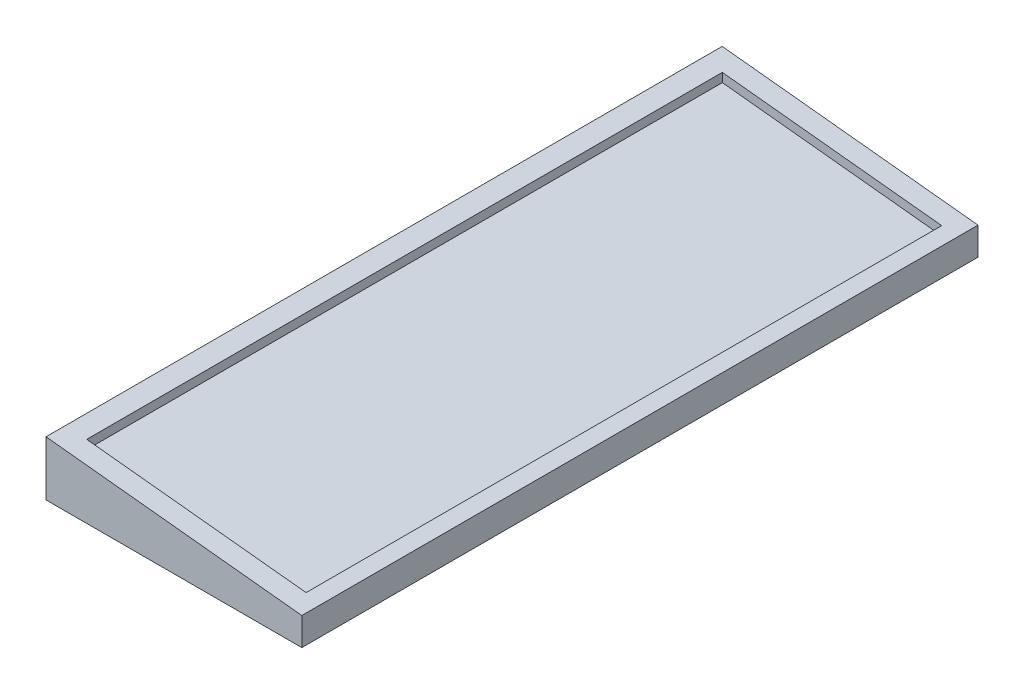
ISO-10303-21;
HEADER;
FILE_DESCRIPTION(('STEP AP214'),'2;1');
FILE_NAME('part.step','',(''),(''),'','','');
FILE_SCHEMA(('AUTOMOTIVE_DESIGN { 1 0 10303 214 1 1 1 1 }'));
ENDSEC;
DATA;
#1=APPLICATION_CONTEXT('core data for automotive mechanical design processes');
#2=APPLICATION_PROTOCOL_DEFINITION('international standard','automotive_design',2000,#1);
#3=PRODUCT_CONTEXT('',#1,'mechanical');
#4=PRODUCT('Part','Part','',(#3));
#5=PRODUCT_RELATED_PRODUCT_CATEGORY('part','',(#4));
#6=PRODUCT_DEFINITION_FORMATION('','',#4);
#7=PRODUCT_DEFINITION_CONTEXT('part definition',#1,'design');
#8=PRODUCT_DEFINITION('design','',#6,#7);
#9=PRODUCT_DEFINITION_SHAPE('','',#8);
#10=(LENGTH_UNIT() NAMED_UNIT(*) SI_UNIT(.MILLI.,.METRE.));
#11=(NAMED_UNIT(*) PLANE_ANGLE_UNIT() SI_UNIT($,.RADIAN.));
#12=(NAMED_UNIT(*) SI_UNIT($,.STERADIAN.) SOLID_ANGLE_UNIT());
#13=UNCERTAINTY_MEASURE_WITH_UNIT(LENGTH_MEASURE(1.E-05),#10,'distance_accuracy_value','');
#14=(GEOMETRIC_REPRESENTATION_CONTEXT(3) GLOBAL_UNCERTAINTY_ASSIGNED_CONTEXT((#13)) GLOBAL_UNIT_ASSIGNED_CONTEXT((#10,
#11,#12)) REPRESENTATION_CONTEXT('',''));
#15=CARTESIAN_POINT('',(0.,0.,0.));
#16=DIRECTION('',(0.,0.,1.));
#17=DIRECTION('',(1.,0.,0.));
#18=AXIS2_PLACEMENT_3D('',#15,#16,#17);
#19=CARTESIAN_POINT('',(1.80331095467036,15.6573576470199,0.));
#20=DIRECTION('',(0.104528463267646,0.994521895368274,0.));
#21=DIRECTION('',(-0.994521895368274,0.104528463267646,0.));
#22=AXIS2_PLACEMENT_3D('',#19,#20,#21);
#23=PLANE('',#22);
#24=DIRECTION('',(1.51465987561138E-13,0.,1.));
#25=VECTOR('',#24,1.);
#26=CARTESIAN_POINT('',(-61.4999999999144,22.3108037346864,9.6942194870283E-12));
#27=LINE('',#26,#25);
#28=CARTESIAN_POINT('',(-61.4999999999707,22.3108037346923,-372.27000000002));
#29=VERTEX_POINT('',#28);
#30=CARTESIAN_POINT('',(-61.499999999916,22.3108037346866,-11.0000000000191));
#31=VERTEX_POINT('',#30);
#32=EDGE_CURVE('E13',#29,#31,#27,.T.);
#33=ORIENTED_EDGE('',*,*,#32,.F.);
#34=DIRECTION('',(-0.994521895368274,0.104528463267646,0.));
#35=VECTOR('',#34,1.);
#36=CARTESIAN_POINT('',(1.80331095467036,15.6573576470199,-372.27000000002));
#37=LINE('',#36,#35);
#38=CARTESIAN_POINT('',(61.4999999999718,9.38298279702108,-372.27000000002));
#39=VERTEX_POINT('',#38);
#40=EDGE_CURVE('E145',#39,#29,#37,.T.);
#41=ORIENTED_EDGE('',*,*,#40,.F.);
#42=DIRECTION('',(0.,0.,-1.));
#43=VECTOR('',#42,1.);
#44=CARTESIAN_POINT('',(61.4999999999718,9.38298279702108,0.));
#45=LINE('',#44,#43);
#46=CARTESIAN_POINT('',(61.4999999999718,9.38298279702108,-11.0000000000191));
#47=VERTEX_POINT('',#46);
#48=EDGE_CURVE('E147',#47,#39,#45,.T.);
#49=ORIENTED_EDGE('',*,*,#48,.F.);
#50=DIRECTION('',(0.994521895368274,-0.104528463267646,0.));
#51=VECTOR('',#50,1.);
#52=CARTESIAN_POINT('',(1.80331095467036,15.6573576470199,-11.0000000000191));
#53=LINE('',#52,#51);
#54=EDGE_CURVE('E58',#31,#47,#53,.T.);
#55=ORIENTED_EDGE('',*,*,#54,.F.);
#56=EDGE_LOOP('',(#33,#41,#49,#55));
#57=FACE_BOUND('',#56,.T.);
#58=DIRECTION('',(-0.994521895368274,0.104528463267646,0.));
#59=VECTOR('',#58,1.);
#60=CARTESIAN_POINT('',(26.6325870070884,13.0476955753304,-3.19999999999993));
#61=LINE('',#60,#59);
#62=CARTESIAN_POINT('',(69.3,8.56316976194593,-3.19999999999993));
#63=VERTEX_POINT('',#62);
#64=CARTESIAN_POINT('',(-69.3,23.1306167697676,-3.19999999999993));
#65=VERTEX_POINT('',#64);
#66=EDGE_CURVE('E138',#63,#65,#61,.T.);
#67=ORIENTED_EDGE('',*,*,#66,.F.);
#68=DIRECTION('',(0.,0.,1.));
#69=VECTOR('',#68,1.);
#70=CARTESIAN_POINT('',(69.3,8.56316976194593,-380.07));
#71=LINE('',#70,#69);
#72=CARTESIAN_POINT('',(69.3,8.56316976194592,-380.07));
#73=VERTEX_POINT('',#72);
#74=EDGE_CURVE('E115',#73,#63,#71,.T.);
#75=ORIENTED_EDGE('',*,*,#74,.F.);
#76=DIRECTION('',(0.994521895368274,-0.104528463267646,0.));
#77=VECTOR('',#76,1.);
#78=CARTESIAN_POINT('',(-110.453041723765,27.4559757490001,-380.07));
#79=LINE('',#78,#77);
#80=CARTESIAN_POINT('',(-69.3,23.1306167697677,-380.07));
#81=VERTEX_POINT('',#80);
#82=EDGE_CURVE('E99',#81,#73,#79,.T.);
#83=ORIENTED_EDGE('',*,*,#82,.F.);
#84=DIRECTION('',(0.,0.,-1.));
#85=VECTOR('',#84,1.);
#86=CARTESIAN_POINT('',(-69.3,23.1306167697676,-3.19999999999993));
#87=LINE('',#86,#85);
#88=EDGE_CURVE('E95',#65,#81,#87,.T.);
#89=ORIENTED_EDGE('',*,*,#88,.F.);
#90=EDGE_LOOP('',(#67,#75,#83,#89));
#91=FACE_BOUND('',#90,.T.);
#92=ADVANCED_FACE('F51',(#57,#91),#23,.T.);
#93=CARTESIAN_POINT('',(0.,0.,0.));
#94=DIRECTION('',(0.,-1.,0.));
#95=DIRECTION('',(1.,0.,0.));
#96=AXIS2_PLACEMENT_3D('',#93,#94,#95);
#97=PLANE('',#96);
#98=DIRECTION('',(-1.,0.,0.));
#99=VECTOR('',#98,1.);
#100=CARTESIAN_POINT('',(69.3,0.,-3.19999999999993));
#101=LINE('',#100,#99);
#102=CARTESIAN_POINT('',(69.3,0.,-3.19999999999993));
#103=VERTEX_POINT('',#102);
#104=CARTESIAN_POINT('',(-69.3,0.,-3.19999999999993));
#105=VERTEX_POINT('',#104);
#106=EDGE_CURVE('E135',#103,#105,#101,.T.);
#107=ORIENTED_EDGE('',*,*,#106,.T.);
#108=DIRECTION('',(0.,0.,-1.));
#109=VECTOR('',#108,1.);
#110=CARTESIAN_POINT('',(-69.3,0.,-3.19999999999993));
#111=LINE('',#110,#109);
#112=CARTESIAN_POINT('',(-69.3,0.,-380.07));
#113=VERTEX_POINT('',#112);
#114=EDGE_CURVE('E122',#105,#113,#111,.T.);
#115=ORIENTED_EDGE('',*,*,#114,.T.);
#116=DIRECTION('',(1.,0.,0.));
#117=VECTOR('',#116,1.);
#118=CARTESIAN_POINT('',(-69.3,0.,-380.07));
#119=LINE('',#118,#117);
#120=CARTESIAN_POINT('',(69.3,0.,-380.07));
#121=VERTEX_POINT('',#120);
#122=EDGE_CURVE('E110',#113,#121,#119,.T.);
#123=ORIENTED_EDGE('',*,*,#122,.T.);
#124=DIRECTION('',(0.,0.,1.));
#125=VECTOR('',#124,1.);
#126=CARTESIAN_POINT('',(69.3,0.,-380.07));
#127=LINE('',#126,#125);
#128=EDGE_CURVE('E121',#121,#103,#127,.T.);
#129=ORIENTED_EDGE('',*,*,#128,.T.);
#130=EDGE_LOOP('',(#107,#115,#123,#129));
#131=FACE_BOUND('',#130,.T.);
#132=ADVANCED_FACE('F120',(#131),#97,.T.);
#133=CARTESIAN_POINT('',(-69.3,419.001013108752,-3.19999999999993));
#134=DIRECTION('',(-1.,0.,0.));
#135=DIRECTION('',(0.,0.,1.));
#136=AXIS2_PLACEMENT_3D('',#133,#134,#135);
#137=PLANE('',#136);
#138=DIRECTION('',(0.,-1.,0.));
#139=VECTOR('',#138,1.);
#140=CARTESIAN_POINT('',(-69.3,419.001013108752,-3.19999999999993));
#141=LINE('',#140,#139);
#142=EDGE_CURVE('E74',#65,#105,#141,.T.);
#143=ORIENTED_EDGE('',*,*,#142,.F.);
#144=ORIENTED_EDGE('',*,*,#88,.T.);
#145=DIRECTION('',(0.,-1.,0.));
#146=VECTOR('',#145,1.);
#147=CARTESIAN_POINT('',(-69.3,419.001013108752,-380.07));
#148=LINE('',#147,#146);
#149=EDGE_CURVE('E128',#81,#113,#148,.T.);
#150=ORIENTED_EDGE('',*,*,#149,.T.);
#151=ORIENTED_EDGE('',*,*,#114,.F.);
#152=EDGE_LOOP('',(#143,#144,#150,#151));
#153=FACE_BOUND('',#152,.T.);
#154=ADVANCED_FACE('F209',(#153),#137,.T.);
#155=CARTESIAN_POINT('',(-69.3,419.001013108752,-380.07));
#156=DIRECTION('',(0.,0.,-1.));
#157=DIRECTION('',(-1.,0.,0.));
#158=AXIS2_PLACEMENT_3D('',#155,#156,#157);
#159=PLANE('',#158);
#160=ORIENTED_EDGE('',*,*,#149,.F.);
#161=ORIENTED_EDGE('',*,*,#82,.T.);
#162=DIRECTION('',(0.,-1.,0.));
#163=VECTOR('',#162,1.);
#164=CARTESIAN_POINT('',(69.3,419.001013108752,-380.07));
#165=LINE('',#164,#163);
#166=EDGE_CURVE('E107',#73,#121,#165,.T.);
#167=ORIENTED_EDGE('',*,*,#166,.T.);
#168=ORIENTED_EDGE('',*,*,#122,.F.);
#169=EDGE_LOOP('',(#160,#161,#167,#168));
#170=FACE_BOUND('',#169,.T.);
#171=ADVANCED_FACE('F109',(#170),#159,.T.);
#172=CARTESIAN_POINT('',(69.3,419.001013108752,-380.07));
#173=DIRECTION('',(1.,0.,0.));
#174=DIRECTION('',(0.,1.,0.));
#175=AXIS2_PLACEMENT_3D('',#172,#173,#174);
#176=PLANE('',#175);
#177=ORIENTED_EDGE('',*,*,#166,.F.);
#178=ORIENTED_EDGE('',*,*,#74,.T.);
#179=DIRECTION('',(0.,-1.,0.));
#180=VECTOR('',#179,1.);
#181=CARTESIAN_POINT('',(69.3,419.001013108752,-3.19999999999993));
#182=LINE('',#181,#180);
#183=EDGE_CURVE('E126',#63,#103,#182,.T.);
#184=ORIENTED_EDGE('',*,*,#183,.T.);
#185=ORIENTED_EDGE('',*,*,#128,.F.);
#186=EDGE_LOOP('',(#177,#178,#184,#185));
#187=FACE_BOUND('',#186,.T.);
#188=ADVANCED_FACE('F124',(#187),#176,.T.);
#189=CARTESIAN_POINT('',(69.3,419.001013108752,-3.19999999999993));
#190=DIRECTION('',(0.,0.,1.));
#191=DIRECTION('',(1.,0.,0.));
#192=AXIS2_PLACEMENT_3D('',#189,#190,#191);
#193=PLANE('',#192);
#194=ORIENTED_EDGE('',*,*,#183,.F.);
#195=ORIENTED_EDGE('',*,*,#66,.T.);
#196=ORIENTED_EDGE('',*,*,#142,.T.);
#197=ORIENTED_EDGE('',*,*,#106,.F.);
#198=EDGE_LOOP('',(#194,#195,#196,#197));
#199=FACE_BOUND('',#198,.T.);
#200=ADVANCED_FACE('F217',(#199),#193,.T.);
#201=CARTESIAN_POINT('',(-61.499999999916,31.,-11.0000000000191));
#202=DIRECTION('',(-1.,0.,1.51465987561138E-13));
#203=DIRECTION('',(1.51465987561138E-13,0.,1.));
#204=AXIS2_PLACEMENT_3D('',#201,#202,#203);
#205=PLANE('',#204);
#206=ORIENTED_EDGE('',*,*,#32,.T.);
#207=DIRECTION('',(0.,-1.,0.));
#208=VECTOR('',#207,1.);
#209=CARTESIAN_POINT('',(-61.499999999916,31.,-11.0000000000191));
#210=LINE('',#209,#208);
#211=CARTESIAN_POINT('',(-61.499999999916,3.5,-11.0000000000191));
#212=VERTEX_POINT('',#211);
#213=EDGE_CURVE('E136',#31,#212,#210,.T.);
#214=ORIENTED_EDGE('',*,*,#213,.T.);
#215=DIRECTION('',(-1.51465987561138E-13,0.,-1.));
#216=VECTOR('',#215,1.);
#217=CARTESIAN_POINT('',(-61.499999999916,3.5,-11.0000000000191));
#218=LINE('',#217,#216);
#219=CARTESIAN_POINT('',(-61.4999999999707,3.5,-372.27000000002));
#220=VERTEX_POINT('',#219);
#221=EDGE_CURVE('E183',#212,#220,#218,.T.);
#222=ORIENTED_EDGE('',*,*,#221,.T.);
#223=DIRECTION('',(0.,-1.,0.));
#224=VECTOR('',#223,1.);
#225=CARTESIAN_POINT('',(-61.4999999999707,31.,-372.27000000002));
#226=LINE('',#225,#224);
#227=EDGE_CURVE('E131',#29,#220,#226,.T.);
#228=ORIENTED_EDGE('',*,*,#227,.F.);
#229=EDGE_LOOP('',(#206,#214,#222,#228));
#230=FACE_BOUND('',#229,.T.);
#231=ADVANCED_FACE('F181',(#230),#205,.F.);
#232=CARTESIAN_POINT('',(61.4999999999718,31.,-11.0000000000191));
#233=DIRECTION('',(0.,0.,1.));
#234=DIRECTION('',(1.,0.,0.));
#235=AXIS2_PLACEMENT_3D('',#232,#233,#234);
#236=PLANE('',#235);
#237=ORIENTED_EDGE('',*,*,#54,.T.);
#238=DIRECTION('',(0.,-1.,0.));
#239=VECTOR('',#238,1.);
#240=CARTESIAN_POINT('',(61.4999999999718,31.,-11.0000000000191));
#241=LINE('',#240,#239);
#242=CARTESIAN_POINT('',(61.4999999999718,3.5,-11.0000000000191));
#243=VERTEX_POINT('',#242);
#244=EDGE_CURVE('E158',#47,#243,#241,.T.);
#245=ORIENTED_EDGE('',*,*,#244,.T.);
#246=DIRECTION('',(-1.,0.,0.));
#247=VECTOR('',#246,1.);
#248=CARTESIAN_POINT('',(61.4999999999718,3.5,-11.0000000000191));
#249=LINE('',#248,#247);
#250=EDGE_CURVE('E184',#243,#212,#249,.T.);
#251=ORIENTED_EDGE('',*,*,#250,.T.);
#252=ORIENTED_EDGE('',*,*,#213,.F.);
#253=EDGE_LOOP('',(#237,#245,#251,#252));
#254=FACE_BOUND('',#253,.T.);
#255=ADVANCED_FACE('F155',(#254),#236,.F.);
#256=CARTESIAN_POINT('',(61.4999999999718,31.,-372.27000000002));
#257=DIRECTION('',(1.,0.,0.));
#258=DIRECTION('',(0.,1.,0.));
#259=AXIS2_PLACEMENT_3D('',#256,#257,#258);
#260=PLANE('',#259);
#261=ORIENTED_EDGE('',*,*,#48,.T.);
#262=DIRECTION('',(0.,-1.,0.));
#263=VECTOR('',#262,1.);
#264=CARTESIAN_POINT('',(61.4999999999718,31.,-372.27000000002));
#265=LINE('',#264,#263);
#266=CARTESIAN_POINT('',(61.4999999999718,3.5,-372.27000000002));
#267=VERTEX_POINT('',#266);
#268=EDGE_CURVE('E65',#39,#267,#265,.T.);
#269=ORIENTED_EDGE('',*,*,#268,.T.);
#270=DIRECTION('',(0.,0.,1.));
#271=VECTOR('',#270,1.);
#272=CARTESIAN_POINT('',(61.4999999999718,3.5,-372.27000000002));
#273=LINE('',#272,#271);
#274=EDGE_CURVE('E169',#267,#243,#273,.T.);
#275=ORIENTED_EDGE('',*,*,#274,.T.);
#276=ORIENTED_EDGE('',*,*,#244,.F.);
#277=EDGE_LOOP('',(#261,#269,#275,#276));
#278=FACE_BOUND('',#277,.T.);
#279=ADVANCED_FACE('F166',(#278),#260,.F.);
#280=CARTESIAN_POINT('',(-61.4999999999707,31.,-372.27000000002));
#281=DIRECTION('',(0.,0.,-1.));
#282=DIRECTION('',(-1.,0.,0.));
#283=AXIS2_PLACEMENT_3D('',#280,#281,#282);
#284=PLANE('',#283);
#285=ORIENTED_EDGE('',*,*,#40,.T.);
#286=ORIENTED_EDGE('',*,*,#227,.T.);
#287=DIRECTION('',(1.,0.,0.));
#288=VECTOR('',#287,1.);
#289=CARTESIAN_POINT('',(-61.4999999999707,3.5,-372.27000000002));
#290=LINE('',#289,#288);
#291=EDGE_CURVE('E186',#220,#267,#290,.T.);
#292=ORIENTED_EDGE('',*,*,#291,.T.);
#293=ORIENTED_EDGE('',*,*,#268,.F.);
#294=EDGE_LOOP('',(#285,#286,#292,#293));
#295=FACE_BOUND('',#294,.T.);
#296=ADVANCED_FACE('F174',(#295),#284,.F.);
#297=CARTESIAN_POINT('',(0.,3.5,0.));
#298=DIRECTION('',(0.,-1.,0.));
#299=DIRECTION('',(1.,0.,0.));
#300=AXIS2_PLACEMENT_3D('',#297,#298,#299);
#301=PLANE('',#300);
#302=ORIENTED_EDGE('',*,*,#221,.F.);
#303=ORIENTED_EDGE('',*,*,#250,.F.);
#304=ORIENTED_EDGE('',*,*,#274,.F.);
#305=ORIENTED_EDGE('',*,*,#291,.F.);
#306=EDGE_LOOP('',(#302,#303,#304,#305));
#307=FACE_BOUND('',#306,.T.);
#308=ADVANCED_FACE('F192',(#307),#301,.F.);
#309=CLOSED_SHELL('',(#92,#132,#154,#171,#188,#200,#231,#255,#279,#296,#308));
#310=MANIFOLD_SOLID_BREP('B2',#309);
#311=CARTESIAN_POINT('',(-397808.75814731,41827.7349544641,-379.27000000002));
#312=DIRECTION('',(0.,0.,-1.));
#313=DIRECTION('',(-1.,0.,0.));
#314=AXIS2_PLACEMENT_3D('',#311,#312,#313);
#315=PLANE('',#314);
#316=DIRECTION('',(-0.994521895368274,0.104528463267646,0.));
#317=VECTOR('',#316,1.);
#318=CARTESIAN_POINT('',(-397808.75814731,41829.2349544641,-379.27000000002));
#319=LINE('',#318,#317);
#320=CARTESIAN_POINT('',(68.4999999999718,10.6500072899536,-379.27000000002));
#321=VERTEX_POINT('',#320);
#322=CARTESIAN_POINT('',(-68.4999999999718,25.0492875213411,-379.27000000002));
#323=VERTEX_POINT('',#322);
#324=EDGE_CURVE('E387',#321,#323,#319,.T.);
#325=ORIENTED_EDGE('',*,*,#324,.F.);
#326=DIRECTION('',(0.,1.,0.));
#327=VECTOR('',#326,1.);
#328=CARTESIAN_POINT('',(68.4999999999718,9.15000728994641,-379.27000000002));
#329=LINE('',#328,#327);
#330=CARTESIAN_POINT('',(68.4999999999718,9.15000728994641,-379.27000000002));
#331=VERTEX_POINT('',#330);
#332=EDGE_CURVE('E49',#331,#321,#329,.T.);
#333=ORIENTED_EDGE('',*,*,#332,.F.);
#334=DIRECTION('',(-0.994521895368274,0.104528463267646,0.));
#335=VECTOR('',#334,1.);
#336=CARTESIAN_POINT('',(-397808.75814731,41827.7349544641,-379.27000000002));
#337=LINE('',#336,#335);
#338=CARTESIAN_POINT('',(-68.4999999999718,23.5492875213339,-379.27000000002));
#339=VERTEX_POINT('',#338);
#340=EDGE_CURVE('E382',#331,#339,#337,.T.);
#341=ORIENTED_EDGE('',*,*,#340,.T.);
#342=DIRECTION('',(0.,1.,0.));
#343=VECTOR('',#342,1.);
#344=CARTESIAN_POINT('',(-68.4999999999718,23.5492875213339,-379.27000000002));
#345=LINE('',#344,#343);
#346=EDGE_CURVE('E325',#339,#323,#345,.T.);
#347=ORIENTED_EDGE('',*,*,#346,.T.);
#348=EDGE_LOOP('',(#325,#333,#341,#347));
#349=FACE_BOUND('',#348,.T.);
#350=ADVANCED_FACE('F322',(#349),#315,.T.);
#351=CARTESIAN_POINT('',(68.4999999999718,9.15000728994641,291468.75));
#352=DIRECTION('',(-1.,0.,0.));
#353=DIRECTION('',(0.,0.,1.));
#354=AXIS2_PLACEMENT_3D('',#351,#352,#353);
#355=PLANE('',#354);
#356=DIRECTION('',(0.,0.,1.));
#357=VECTOR('',#356,1.);
#358=CARTESIAN_POINT('',(68.4999999999718,10.6500072899536,291468.75));
#359=LINE('',#358,#357);
#360=CARTESIAN_POINT('',(68.4999999999718,10.6500072899536,-4.0000000000191));
#361=VERTEX_POINT('',#360);
#362=EDGE_CURVE('E355',#321,#361,#359,.T.);
#363=ORIENTED_EDGE('',*,*,#362,.T.);
#364=DIRECTION('',(0.,1.,0.));
#365=VECTOR('',#364,1.);
#366=CARTESIAN_POINT('',(68.4999999999718,9.15000728994641,-4.0000000000191));
#367=LINE('',#366,#365);
#368=CARTESIAN_POINT('',(68.4999999999718,9.15000728994641,-4.0000000000191));
#369=VERTEX_POINT('',#368);
#370=EDGE_CURVE('E331',#369,#361,#367,.T.);
#371=ORIENTED_EDGE('',*,*,#370,.F.);
#372=DIRECTION('',(0.,0.,1.));
#373=VECTOR('',#372,1.);
#374=CARTESIAN_POINT('',(68.4999999999718,9.15000728994641,291468.75));
#375=LINE('',#374,#373);
#376=EDGE_CURVE('E372',#331,#369,#375,.T.);
#377=ORIENTED_EDGE('',*,*,#376,.F.);
#378=ORIENTED_EDGE('',*,*,#332,.T.);
#379=EDGE_LOOP('',(#363,#371,#377,#378));
#380=FACE_BOUND('',#379,.T.);
#381=ADVANCED_FACE('F397',(#380),#355,.F.);
#382=CARTESIAN_POINT('',(-397808.75814731,41827.7349544641,-4.0000000000191));
#383=DIRECTION('',(0.,0.,-1.));
#384=DIRECTION('',(-1.,0.,0.));
#385=AXIS2_PLACEMENT_3D('',#382,#383,#384);
#386=PLANE('',#385);
#387=DIRECTION('',(-0.994521895368274,0.104528463267646,0.));
#388=VECTOR('',#387,1.);
#389=CARTESIAN_POINT('',(-397808.75814731,41829.2349544641,-4.0000000000191));
#390=LINE('',#389,#388);
#391=CARTESIAN_POINT('',(-68.499999999915,25.049287521334,-4.0000000000191));
#392=VERTEX_POINT('',#391);
#393=EDGE_CURVE('E379',#361,#392,#390,.T.);
#394=ORIENTED_EDGE('',*,*,#393,.T.);
#395=DIRECTION('',(0.,1.,0.));
#396=VECTOR('',#395,1.);
#397=CARTESIAN_POINT('',(-68.499999999915,23.5492875213268,-4.0000000000191));
#398=LINE('',#397,#396);
#399=CARTESIAN_POINT('',(-68.499999999915,23.5492875213268,-4.0000000000191));
#400=VERTEX_POINT('',#399);
#401=EDGE_CURVE('E376',#400,#392,#398,.T.);
#402=ORIENTED_EDGE('',*,*,#401,.F.);
#403=DIRECTION('',(-0.994521895368274,0.104528463267646,0.));
#404=VECTOR('',#403,1.);
#405=CARTESIAN_POINT('',(-397808.75814731,41827.7349544641,-4.0000000000191));
#406=LINE('',#405,#404);
#407=EDGE_CURVE('E367',#369,#400,#406,.T.);
#408=ORIENTED_EDGE('',*,*,#407,.F.);
#409=ORIENTED_EDGE('',*,*,#370,.T.);
#410=EDGE_LOOP('',(#394,#402,#408,#409));
#411=FACE_BOUND('',#410,.T.);
#412=ADVANCED_FACE('F377',(#411),#386,.F.);
#413=CARTESIAN_POINT('',(-68.4999999999718,23.5492875213339,291468.75));
#414=DIRECTION('',(-1.,0.,0.));
#415=DIRECTION('',(0.,0.,1.));
#416=AXIS2_PLACEMENT_3D('',#413,#414,#415);
#417=PLANE('',#416);
#418=DIRECTION('',(0.,0.,1.));
#419=VECTOR('',#418,1.);
#420=CARTESIAN_POINT('',(-68.4999999999718,25.0492875213411,291468.75));
#421=LINE('',#420,#419);
#422=EDGE_CURVE('E390',#323,#392,#421,.T.);
#423=ORIENTED_EDGE('',*,*,#422,.F.);
#424=ORIENTED_EDGE('',*,*,#346,.F.);
#425=DIRECTION('',(0.,0.,1.));
#426=VECTOR('',#425,1.);
#427=CARTESIAN_POINT('',(-68.4999999999718,23.5492875213339,291468.75));
#428=LINE('',#427,#426);
#429=EDGE_CURVE('E371',#339,#400,#428,.T.);
#430=ORIENTED_EDGE('',*,*,#429,.T.);
#431=ORIENTED_EDGE('',*,*,#401,.T.);
#432=EDGE_LOOP('',(#423,#424,#430,#431));
#433=FACE_BOUND('',#432,.T.);
#434=ADVANCED_FACE('F381',(#433),#417,.T.);
#435=CARTESIAN_POINT('',(1.85557518630419,16.1546185947041,0.));
#436=DIRECTION('',(0.104528463267646,0.994521895368274,0.));
#437=DIRECTION('',(-0.994521895368274,0.104528463267646,0.));
#438=AXIS2_PLACEMENT_3D('',#435,#436,#437);
#439=PLANE('',#438);
#440=ORIENTED_EDGE('',*,*,#340,.F.);
#441=ORIENTED_EDGE('',*,*,#376,.T.);
#442=ORIENTED_EDGE('',*,*,#407,.T.);
#443=ORIENTED_EDGE('',*,*,#429,.F.);
#444=EDGE_LOOP('',(#440,#441,#442,#443));
#445=FACE_BOUND('',#444,.T.);
#446=ADVANCED_FACE('F370',(#445),#439,.F.);
#447=CARTESIAN_POINT('',(1.85557518630419,17.6546185947112,0.));
#448=DIRECTION('',(0.104528463267646,0.994521895368274,0.));
#449=DIRECTION('',(-0.994521895368274,0.104528463267646,0.));
#450=AXIS2_PLACEMENT_3D('',#447,#448,#449);
#451=PLANE('',#450);
#452=ORIENTED_EDGE('',*,*,#324,.T.);
#453=ORIENTED_EDGE('',*,*,#422,.T.);
#454=ORIENTED_EDGE('',*,*,#393,.F.);
#455=ORIENTED_EDGE('',*,*,#362,.F.);
#456=EDGE_LOOP('',(#452,#453,#454,#455));
#457=FACE_BOUND('',#456,.T.);
#458=ADVANCED_FACE('F395',(#457),#451,.T.);
#459=CLOSED_SHELL('',(#350,#381,#412,#434,#446,#458));
#460=MANIFOLD_SOLID_BREP('B7',#459);
#461=CARTESIAN_POINT('',(61.1630965651489,4.9054532631078,-12.5));
#462=DIRECTION('',(0.,0.,-1.));
#463=DIRECTION('',(-1.,0.,0.));
#464=AXIS2_PLACEMENT_3D('',#461,#462,#463);
#465=PLANE('',#464);
#466=DIRECTION('',(-0.994521895368274,0.104528463267646,0.));
#467=VECTOR('',#466,1.);
#468=CARTESIAN_POINT('',(61.3282515371118,6.47679785778967,-12.5));
#469=LINE('',#468,#467);
#470=CARTESIAN_POINT('',(61.3282515371118,6.47679785778967,-12.5));
#471=VERTEX_POINT('',#470);
#472=CARTESIAN_POINT('',(-60.997941593186,19.3337988397102,-12.5));
#473=VERTEX_POINT('',#472);
#474=EDGE_CURVE('E530',#471,#473,#469,.T.);
#475=ORIENTED_EDGE('',*,*,#474,.T.);
#476=DIRECTION('',(0.104528463267646,0.994521895368274,0.));
#477=VECTOR('',#476,1.);
#478=CARTESIAN_POINT('',(-61.1630965651488,17.7624542450283,-12.5));
#479=LINE('',#478,#477);
#480=CARTESIAN_POINT('',(-61.1630965651488,17.7624542450283,-12.5));
#481=VERTEX_POINT('',#480);
#482=EDGE_CURVE('E320',#481,#473,#479,.T.);
#483=ORIENTED_EDGE('',*,*,#482,.F.);
#484=DIRECTION('',(-0.994521895368274,0.104528463267646,0.));
#485=VECTOR('',#484,1.);
#486=CARTESIAN_POINT('',(61.1630965651489,4.9054532631078,-12.5));
#487=LINE('',#486,#485);
#488=CARTESIAN_POINT('',(61.1630965651489,4.9054532631078,-12.5));
#489=VERTEX_POINT('',#488);
#490=EDGE_CURVE('E518',#489,#481,#487,.T.);
#491=ORIENTED_EDGE('',*,*,#490,.F.);
#492=DIRECTION('',(0.104528463267646,0.994521895368274,0.));
#493=VECTOR('',#492,1.);
#494=CARTESIAN_POINT('',(61.1630965651489,4.9054532631078,-12.5));
#495=LINE('',#494,#493);
#496=EDGE_CURVE('E526',#489,#471,#495,.T.);
#497=ORIENTED_EDGE('',*,*,#496,.T.);
#498=EDGE_LOOP('',(#475,#483,#491,#497));
#499=FACE_BOUND('',#498,.T.);
#500=ADVANCED_FACE('F467',(#499),#465,.F.);
#501=CARTESIAN_POINT('',(-61.1630965651488,17.7624542450283,-12.5));
#502=DIRECTION('',(0.994521895368274,-0.104528463267646,0.));
#503=DIRECTION('',(0.104528463267646,0.994521895368274,0.));
#504=AXIS2_PLACEMENT_3D('',#501,#502,#503);
#505=PLANE('',#504);
#506=DIRECTION('',(0.,0.,-1.));
#507=VECTOR('',#506,1.);
#508=CARTESIAN_POINT('',(-60.997941593186,19.3337988397102,-12.5));
#509=LINE('',#508,#507);
#510=CARTESIAN_POINT('',(-60.997941593186,19.3337988397102,-370.77));
#511=VERTEX_POINT('',#510);
#512=EDGE_CURVE('E522',#473,#511,#509,.T.);
#513=ORIENTED_EDGE('',*,*,#512,.T.);
#514=DIRECTION('',(0.104528463267646,0.994521895368274,0.));
#515=VECTOR('',#514,1.);
#516=CARTESIAN_POINT('',(-61.1630965651488,17.7624542450283,-370.77));
#517=LINE('',#516,#515);
#518=CARTESIAN_POINT('',(-61.1630965651488,17.7624542450283,-370.77));
#519=VERTEX_POINT('',#518);
#520=EDGE_CURVE('E475',#519,#511,#517,.T.);
#521=ORIENTED_EDGE('',*,*,#520,.F.);
#522=DIRECTION('',(0.,0.,-1.));
#523=VECTOR('',#522,1.);
#524=CARTESIAN_POINT('',(-61.1630965651488,17.7624542450283,-12.5));
#525=LINE('',#524,#523);
#526=EDGE_CURVE('E513',#481,#519,#525,.T.);
#527=ORIENTED_EDGE('',*,*,#526,.F.);
#528=ORIENTED_EDGE('',*,*,#482,.T.);
#529=EDGE_LOOP('',(#513,#521,#527,#528));
#530=FACE_BOUND('',#529,.T.);
#531=ADVANCED_FACE('F521',(#530),#505,.F.);
#532=CARTESIAN_POINT('',(-61.1630965651488,17.7624542450283,-370.77));
#533=DIRECTION('',(0.,0.,1.));
#534=DIRECTION('',(1.,0.,0.));
#535=AXIS2_PLACEMENT_3D('',#532,#533,#534);
#536=PLANE('',#535);
#537=DIRECTION('',(0.994521895368274,-0.104528463267646,0.));
#538=VECTOR('',#537,1.);
#539=CARTESIAN_POINT('',(-60.997941593186,19.3337988397102,-370.77));
#540=LINE('',#539,#538);
#541=CARTESIAN_POINT('',(61.3282515371118,6.47679785778967,-370.77));
#542=VERTEX_POINT('',#541);
#543=EDGE_CURVE('E500',#511,#542,#540,.T.);
#544=ORIENTED_EDGE('',*,*,#543,.T.);
#545=DIRECTION('',(0.104528463267646,0.994521895368274,0.));
#546=VECTOR('',#545,1.);
#547=CARTESIAN_POINT('',(61.1630965651489,4.9054532631078,-370.77));
#548=LINE('',#547,#546);
#549=CARTESIAN_POINT('',(61.1630965651489,4.9054532631078,-370.77));
#550=VERTEX_POINT('',#549);
#551=EDGE_CURVE('E523',#550,#542,#548,.T.);
#552=ORIENTED_EDGE('',*,*,#551,.F.);
#553=DIRECTION('',(0.994521895368274,-0.104528463267646,0.));
#554=VECTOR('',#553,1.);
#555=CARTESIAN_POINT('',(-61.1630965651488,17.7624542450283,-370.77));
#556=LINE('',#555,#554);
#557=EDGE_CURVE('E516',#519,#550,#556,.T.);
#558=ORIENTED_EDGE('',*,*,#557,.F.);
#559=ORIENTED_EDGE('',*,*,#520,.T.);
#560=EDGE_LOOP('',(#544,#552,#558,#559));
#561=FACE_BOUND('',#560,.T.);
#562=ADVANCED_FACE('F524',(#561),#536,.F.);
#563=CARTESIAN_POINT('',(61.1630965651489,4.9054532631078,-370.77));
#564=DIRECTION('',(-0.994521895368274,0.104528463267646,0.));
#565=DIRECTION('',(-0.104528463267646,-0.994521895368274,0.));
#566=AXIS2_PLACEMENT_3D('',#563,#564,#565);
#567=PLANE('',#566);
#568=DIRECTION('',(0.,0.,1.));
#569=VECTOR('',#568,1.);
#570=CARTESIAN_POINT('',(61.3282515371118,6.47679785778967,-370.77));
#571=LINE('',#570,#569);
#572=EDGE_CURVE('E506',#542,#471,#571,.T.);
#573=ORIENTED_EDGE('',*,*,#572,.T.);
#574=ORIENTED_EDGE('',*,*,#496,.F.);
#575=DIRECTION('',(0.,0.,1.));
#576=VECTOR('',#575,1.);
#577=CARTESIAN_POINT('',(61.1630965651489,4.9054532631078,-370.77));
#578=LINE('',#577,#576);
#579=EDGE_CURVE('E483',#550,#489,#578,.T.);
#580=ORIENTED_EDGE('',*,*,#579,.F.);
#581=ORIENTED_EDGE('',*,*,#551,.T.);
#582=EDGE_LOOP('',(#573,#574,#580,#581));
#583=FACE_BOUND('',#582,.T.);
#584=ADVANCED_FACE('F537',(#583),#567,.F.);
#585=CARTESIAN_POINT('',(1.17823074432921,11.2101167127188,0.));
#586=DIRECTION('',(-0.104528463267646,-0.994521895368274,0.));
#587=DIRECTION('',(0.994521895368274,-0.104528463267646,0.));
#588=AXIS2_PLACEMENT_3D('',#585,#586,#587);
#589=PLANE('',#588);
#590=ORIENTED_EDGE('',*,*,#490,.T.);
#591=ORIENTED_EDGE('',*,*,#526,.T.);
#592=ORIENTED_EDGE('',*,*,#557,.T.);
#593=ORIENTED_EDGE('',*,*,#579,.T.);
#594=EDGE_LOOP('',(#590,#591,#592,#593));
#595=FACE_BOUND('',#594,.T.);
#596=ADVANCED_FACE('F514',(#595),#589,.T.);
#597=CARTESIAN_POINT('',(1.34338571629209,12.7814613074007,0.));
#598=DIRECTION('',(-0.104528463267646,-0.994521895368274,0.));
#599=DIRECTION('',(0.994521895368274,-0.104528463267646,0.));
#600=AXIS2_PLACEMENT_3D('',#597,#598,#599);
#601=PLANE('',#600);
#602=ORIENTED_EDGE('',*,*,#474,.F.);
#603=ORIENTED_EDGE('',*,*,#572,.F.);
#604=ORIENTED_EDGE('',*,*,#543,.F.);
#605=ORIENTED_EDGE('',*,*,#512,.F.);
#606=EDGE_LOOP('',(#602,#603,#604,#605));
#607=FACE_BOUND('',#606,.T.);
#608=ADVANCED_FACE('F540',(#607),#601,.F.);
#609=CLOSED_SHELL('',(#500,#531,#562,#584,#596,#608));
#610=MANIFOLD_SOLID_BREP('B43',#609);
#611=CARTESIAN_POINT('',(72.5,15.759885886478,-383.27));
#612=DIRECTION('',(0.104528463267646,0.994521895368274,0.));
#613=DIRECTION('',(-0.994521895368274,0.104528463267646,0.));
#614=AXIS2_PLACEMENT_3D('',#611,#612,#613);
#615=PLANE('',#614);
#616=DIRECTION('',(-0.994521895368274,0.104528463267646,0.));
#617=VECTOR('',#616,1.);
#618=CARTESIAN_POINT('',(72.5,15.759885886478,0.));
#619=LINE('',#618,#617);
#620=CARTESIAN_POINT('',(72.5,15.759885886478,0.));
#621=VERTEX_POINT('',#620);
#622=CARTESIAN_POINT('',(-72.5,31.,0.));
#623=VERTEX_POINT('',#622);
#624=EDGE_CURVE('E741',#621,#623,#619,.T.);
#625=ORIENTED_EDGE('',*,*,#624,.F.);
#626=DIRECTION('',(0.,0.,1.));
#627=VECTOR('',#626,1.);
#628=CARTESIAN_POINT('',(72.5,15.759885886478,-383.27));
#629=LINE('',#628,#627);
#630=CARTESIAN_POINT('',(72.5,15.759885886478,-383.27));
#631=VERTEX_POINT('',#630);
#632=EDGE_CURVE('E766',#631,#621,#629,.T.);
#633=ORIENTED_EDGE('',*,*,#632,.F.);
#634=DIRECTION('',(-0.994521895368274,0.104528463267646,0.));
#635=VECTOR('',#634,1.);
#636=CARTESIAN_POINT('',(72.5,15.759885886478,-383.27));
#637=LINE('',#636,#635);
#638=CARTESIAN_POINT('',(-72.5,31.,-383.27));
#639=VERTEX_POINT('',#638);
#640=EDGE_CURVE('E742',#631,#639,#637,.T.);
#641=ORIENTED_EDGE('',*,*,#640,.T.);
#642=DIRECTION('',(0.,0.,1.));
#643=VECTOR('',#642,1.);
#644=CARTESIAN_POINT('',(-72.5,31.,-383.27));
#645=LINE('',#644,#643);
#646=EDGE_CURVE('E755',#639,#623,#645,.T.);
#647=ORIENTED_EDGE('',*,*,#646,.T.);
#648=EDGE_LOOP('',(#625,#633,#641,#647));
#649=FACE_BOUND('',#648,.T.);
#650=DIRECTION('',(-0.994521895368274,0.104528463267646,0.));
#651=VECTOR('',#650,1.);
#652=CARTESIAN_POINT('',(72.5,15.759885886478,-11.5));
#653=LINE('',#652,#651);
#654=CARTESIAN_POINT('',(63.4153475550953,16.7147213343541,-11.5));
#655=VERTEX_POINT('',#654);
#656=CARTESIAN_POINT('',(-60.9108455752025,29.7819307868059,-11.5));
#657=VERTEX_POINT('',#656);
#658=EDGE_CURVE('E704',#655,#657,#653,.T.);
#659=ORIENTED_EDGE('',*,*,#658,.T.);
#660=DIRECTION('',(0.,0.,-1.));
#661=VECTOR('',#660,1.);
#662=CARTESIAN_POINT('',(-60.9108455752024,29.7819307868059,-383.27));
#663=LINE('',#662,#661);
#664=CARTESIAN_POINT('',(-60.9108455752025,29.7819307868059,-371.77));
#665=VERTEX_POINT('',#664);
#666=EDGE_CURVE('E698',#657,#665,#663,.T.);
#667=ORIENTED_EDGE('',*,*,#666,.T.);
#668=DIRECTION('',(0.994521895368274,-0.104528463267646,0.));
#669=VECTOR('',#668,1.);
#670=CARTESIAN_POINT('',(72.5,15.759885886478,-371.77));
#671=LINE('',#670,#669);
#672=CARTESIAN_POINT('',(63.4153475550953,16.7147213343541,-371.77));
#673=VERTEX_POINT('',#672);
#674=EDGE_CURVE('E687',#665,#673,#671,.T.);
#675=ORIENTED_EDGE('',*,*,#674,.T.);
#676=DIRECTION('',(0.,0.,1.));
#677=VECTOR('',#676,1.);
#678=CARTESIAN_POINT('',(63.4153475550953,16.7147213343541,-383.27));
#679=LINE('',#678,#677);
#680=EDGE_CURVE('E692',#673,#655,#679,.T.);
#681=ORIENTED_EDGE('',*,*,#680,.T.);
#682=EDGE_LOOP('',(#659,#667,#675,#681));
#683=FACE_BOUND('',#682,.T.);
#684=ADVANCED_FACE('F603',(#649,#683),#615,.T.);
#685=CARTESIAN_POINT('',(71.9773576836618,10.7872764096366,-383.27));
#686=DIRECTION('',(0.104528463267646,0.994521895368274,0.));
#687=DIRECTION('',(-0.994521895368274,0.104528463267646,0.));
#688=AXIS2_PLACEMENT_3D('',#685,#686,#687);
#689=PLANE('',#688);
#690=DIRECTION('',(0.,0.,1.));
#691=VECTOR('',#690,1.);
#692=CARTESIAN_POINT('',(69.5,11.0476571944574,-380.27));
#693=LINE('',#692,#691);
#694=CARTESIAN_POINT('',(69.5,11.0476571944574,-380.27));
#695=VERTEX_POINT('',#694);
#696=CARTESIAN_POINT('',(69.5,11.0476571944575,-2.99999999999993));
#697=VERTEX_POINT('',#696);
#698=EDGE_CURVE('E724',#695,#697,#693,.T.);
#699=ORIENTED_EDGE('',*,*,#698,.T.);
#700=DIRECTION('',(-0.994521895368274,0.104528463267646,0.));
#701=VECTOR('',#700,1.);
#702=CARTESIAN_POINT('',(-111.172191620094,30.0370697284599,-2.99999999999993));
#703=LINE('',#702,#701);
#704=CARTESIAN_POINT('',(-69.5,25.6571458963855,-2.99999999999993));
#705=VERTEX_POINT('',#704);
#706=EDGE_CURVE('E715',#697,#705,#703,.T.);
#707=ORIENTED_EDGE('',*,*,#706,.T.);
#708=DIRECTION('',(0.,0.,-1.));
#709=VECTOR('',#708,1.);
#710=CARTESIAN_POINT('',(-69.5,25.6571458963854,-380.27));
#711=LINE('',#710,#709);
#712=CARTESIAN_POINT('',(-69.5,25.6571458963854,-380.27));
#713=VERTEX_POINT('',#712);
#714=EDGE_CURVE('E733',#705,#713,#711,.T.);
#715=ORIENTED_EDGE('',*,*,#714,.T.);
#716=DIRECTION('',(0.994521895368274,-0.104528463267646,0.));
#717=VECTOR('',#716,1.);
#718=CARTESIAN_POINT('',(-111.172191620094,30.0370697284598,-380.27));
#719=LINE('',#718,#717);
#720=EDGE_CURVE('E729',#713,#695,#719,.T.);
#721=ORIENTED_EDGE('',*,*,#720,.T.);
#722=EDGE_LOOP('',(#699,#707,#715,#721));
#723=FACE_BOUND('',#722,.T.);
#724=DIRECTION('',(0.,0.,-1.));
#725=VECTOR('',#724,1.);
#726=CARTESIAN_POINT('',(-60.9108455752024,24.7543893889883,-383.27));
#727=LINE('',#726,#725);
#728=CARTESIAN_POINT('',(-60.9108455752025,24.7543893889883,-11.5));
#729=VERTEX_POINT('',#728);
#730=CARTESIAN_POINT('',(-60.9108455752025,24.7543893889883,-371.77));
#731=VERTEX_POINT('',#730);
#732=EDGE_CURVE('E465',#729,#731,#727,.T.);
#733=ORIENTED_EDGE('',*,*,#732,.F.);
#734=DIRECTION('',(-0.994521895368274,0.104528463267646,0.));
#735=VECTOR('',#734,1.);
#736=CARTESIAN_POINT('',(71.9773576836618,10.7872764096366,-11.5));
#737=LINE('',#736,#735);
#738=CARTESIAN_POINT('',(63.4153475550953,11.6871799365365,-11.5));
#739=VERTEX_POINT('',#738);
#740=EDGE_CURVE('E610',#739,#729,#737,.T.);
#741=ORIENTED_EDGE('',*,*,#740,.F.);
#742=DIRECTION('',(0.,0.,1.));
#743=VECTOR('',#742,1.);
#744=CARTESIAN_POINT('',(63.4153475550953,11.6871799365365,-383.27));
#745=LINE('',#744,#743);
#746=CARTESIAN_POINT('',(63.4153475550953,11.6871799365365,-371.77));
#747=VERTEX_POINT('',#746);
#748=EDGE_CURVE('E775',#747,#739,#745,.T.);
#749=ORIENTED_EDGE('',*,*,#748,.F.);
#750=DIRECTION('',(0.994521895368274,-0.104528463267646,0.));
#751=VECTOR('',#750,1.);
#752=CARTESIAN_POINT('',(71.9773576836618,10.7872764096366,-371.77));
#753=LINE('',#752,#751);
#754=EDGE_CURVE('E768',#731,#747,#753,.T.);
#755=ORIENTED_EDGE('',*,*,#754,.F.);
#756=EDGE_LOOP('',(#733,#741,#749,#755));
#757=FACE_BOUND('',#756,.T.);
#758=ADVANCED_FACE('F785',(#723,#757),#689,.F.);
#759=CARTESIAN_POINT('',(72.5,0.,-383.27));
#760=DIRECTION('',(1.,0.,0.));
#761=DIRECTION('',(0.,0.,-1.));
#762=AXIS2_PLACEMENT_3D('',#759,#760,#761);
#763=PLANE('',#762);
#764=DIRECTION('',(0.,1.,0.));
#765=VECTOR('',#764,1.);
#766=CARTESIAN_POINT('',(72.5,0.,0.));
#767=LINE('',#766,#765);
#768=CARTESIAN_POINT('',(72.5,0.,0.));
#769=VERTEX_POINT('',#768);
#770=EDGE_CURVE('E746',#769,#621,#767,.T.);
#771=ORIENTED_EDGE('',*,*,#770,.F.);
#772=DIRECTION('',(0.,0.,1.));
#773=VECTOR('',#772,1.);
#774=CARTESIAN_POINT('',(72.5,0.,-383.27));
#775=LINE('',#774,#773);
#776=CARTESIAN_POINT('',(72.5,0.,-383.27));
#777=VERTEX_POINT('',#776);
#778=EDGE_CURVE('E769',#777,#769,#775,.T.);
#779=ORIENTED_EDGE('',*,*,#778,.F.);
#780=DIRECTION('',(0.,1.,0.));
#781=VECTOR('',#780,1.);
#782=CARTESIAN_POINT('',(72.5,0.,-383.27));
#783=LINE('',#782,#781);
#784=EDGE_CURVE('E752',#777,#631,#783,.T.);
#785=ORIENTED_EDGE('',*,*,#784,.T.);
#786=ORIENTED_EDGE('',*,*,#632,.T.);
#787=EDGE_LOOP('',(#771,#779,#785,#786));
#788=FACE_BOUND('',#787,.T.);
#789=ADVANCED_FACE('F803',(#788),#763,.T.);
#790=CARTESIAN_POINT('',(-72.5,0.,-383.27));
#791=DIRECTION('',(0.,-1.,0.));
#792=DIRECTION('',(1.,0.,0.));
#793=AXIS2_PLACEMENT_3D('',#790,#791,#792);
#794=PLANE('',#793);
#795=DIRECTION('',(-1.,0.,0.));
#796=VECTOR('',#795,1.);
#797=CARTESIAN_POINT('',(-69.5,0.,-2.99999999999993));
#798=LINE('',#797,#796);
#799=CARTESIAN_POINT('',(69.5,0.,-2.99999999999993));
#800=VERTEX_POINT('',#799);
#801=CARTESIAN_POINT('',(-69.5,0.,-2.99999999999993));
#802=VERTEX_POINT('',#801);
#803=EDGE_CURVE('E708',#800,#802,#798,.T.);
#804=ORIENTED_EDGE('',*,*,#803,.F.);
#805=DIRECTION('',(0.,0.,1.));
#806=VECTOR('',#805,1.);
#807=CARTESIAN_POINT('',(69.5,0.,-380.27));
#808=LINE('',#807,#806);
#809=CARTESIAN_POINT('',(69.5,0.,-380.27));
#810=VERTEX_POINT('',#809);
#811=EDGE_CURVE('E705',#810,#800,#808,.T.);
#812=ORIENTED_EDGE('',*,*,#811,.F.);
#813=DIRECTION('',(1.,0.,0.));
#814=VECTOR('',#813,1.);
#815=CARTESIAN_POINT('',(-69.5,0.,-380.27));
#816=LINE('',#815,#814);
#817=CARTESIAN_POINT('',(-69.5,0.,-380.27));
#818=VERTEX_POINT('',#817);
#819=EDGE_CURVE('E713',#818,#810,#816,.T.);
#820=ORIENTED_EDGE('',*,*,#819,.F.);
#821=DIRECTION('',(0.,0.,-1.));
#822=VECTOR('',#821,1.);
#823=CARTESIAN_POINT('',(-69.5,0.,-380.27));
#824=LINE('',#823,#822);
#825=EDGE_CURVE('E716',#802,#818,#824,.T.);
#826=ORIENTED_EDGE('',*,*,#825,.F.);
#827=EDGE_LOOP('',(#804,#812,#820,#826));
#828=FACE_BOUND('',#827,.T.);
#829=DIRECTION('',(1.,0.,0.));
#830=VECTOR('',#829,1.);
#831=CARTESIAN_POINT('',(-72.5,0.,0.));
#832=LINE('',#831,#830);
#833=CARTESIAN_POINT('',(-72.5,0.,0.));
#834=VERTEX_POINT('',#833);
#835=EDGE_CURVE('E761',#834,#769,#832,.T.);
#836=ORIENTED_EDGE('',*,*,#835,.F.);
#837=DIRECTION('',(0.,0.,1.));
#838=VECTOR('',#837,1.);
#839=CARTESIAN_POINT('',(-72.5,0.,-383.27));
#840=LINE('',#839,#838);
#841=CARTESIAN_POINT('',(-72.5,0.,-383.27));
#842=VERTEX_POINT('',#841);
#843=EDGE_CURVE('E771',#842,#834,#840,.T.);
#844=ORIENTED_EDGE('',*,*,#843,.F.);
#845=DIRECTION('',(1.,0.,0.));
#846=VECTOR('',#845,1.);
#847=CARTESIAN_POINT('',(-72.5,0.,-383.27));
#848=LINE('',#847,#846);
#849=EDGE_CURVE('E749',#842,#777,#848,.T.);
#850=ORIENTED_EDGE('',*,*,#849,.T.);
#851=ORIENTED_EDGE('',*,*,#778,.T.);
#852=EDGE_LOOP('',(#836,#844,#850,#851));
#853=FACE_BOUND('',#852,.T.);
#854=ADVANCED_FACE('F822',(#828,#853),#794,.T.);
#855=CARTESIAN_POINT('',(-72.5,31.,-383.27));
#856=DIRECTION('',(-1.,0.,0.));
#857=DIRECTION('',(0.,0.,1.));
#858=AXIS2_PLACEMENT_3D('',#855,#856,#857);
#859=PLANE('',#858);
#860=DIRECTION('',(0.,-1.,0.));
#861=VECTOR('',#860,1.);
#862=CARTESIAN_POINT('',(-72.5,31.,0.));
#863=LINE('',#862,#861);
#864=EDGE_CURVE('E758',#623,#834,#863,.T.);
#865=ORIENTED_EDGE('',*,*,#864,.F.);
#866=ORIENTED_EDGE('',*,*,#646,.F.);
#867=DIRECTION('',(0.,-1.,0.));
#868=VECTOR('',#867,1.);
#869=CARTESIAN_POINT('',(-72.5,31.,-383.27));
#870=LINE('',#869,#868);
#871=EDGE_CURVE('E745',#639,#842,#870,.T.);
#872=ORIENTED_EDGE('',*,*,#871,.T.);
#873=ORIENTED_EDGE('',*,*,#843,.T.);
#874=EDGE_LOOP('',(#865,#866,#872,#873));
#875=FACE_BOUND('',#874,.T.);
#876=ADVANCED_FACE('F820',(#875),#859,.T.);
#877=CARTESIAN_POINT('',(0.,0.,-383.27));
#878=DIRECTION('',(0.,0.,1.));
#879=DIRECTION('',(1.,0.,0.));
#880=AXIS2_PLACEMENT_3D('',#877,#878,#879);
#881=PLANE('',#880);
#882=ORIENTED_EDGE('',*,*,#640,.F.);
#883=ORIENTED_EDGE('',*,*,#784,.F.);
#884=ORIENTED_EDGE('',*,*,#849,.F.);
#885=ORIENTED_EDGE('',*,*,#871,.F.);
#886=EDGE_LOOP('',(#882,#883,#884,#885));
#887=FACE_BOUND('',#886,.T.);
#888=ADVANCED_FACE('F817',(#887),#881,.F.);
#889=CARTESIAN_POINT('',(0.,0.,0.));
#890=DIRECTION('',(0.,0.,1.));
#891=DIRECTION('',(1.,0.,0.));
#892=AXIS2_PLACEMENT_3D('',#889,#890,#891);
#893=PLANE('',#892);
#894=ORIENTED_EDGE('',*,*,#624,.T.);
#895=ORIENTED_EDGE('',*,*,#864,.T.);
#896=ORIENTED_EDGE('',*,*,#835,.T.);
#897=ORIENTED_EDGE('',*,*,#770,.T.);
#898=EDGE_LOOP('',(#894,#895,#896,#897));
#899=FACE_BOUND('',#898,.T.);
#900=ADVANCED_FACE('F811',(#899),#893,.T.);
#901=CARTESIAN_POINT('',(-69.5,426.521488408262,-2.99999999999993));
#902=DIRECTION('',(0.,0.,1.));
#903=DIRECTION('',(1.,0.,0.));
#904=AXIS2_PLACEMENT_3D('',#901,#902,#903);
#905=PLANE('',#904);
#906=DIRECTION('',(0.,-1.,0.));
#907=VECTOR('',#906,1.);
#908=CARTESIAN_POINT('',(69.5,426.521488408262,-2.99999999999993));
#909=LINE('',#908,#907);
#910=EDGE_CURVE('E727',#697,#800,#909,.T.);
#911=ORIENTED_EDGE('',*,*,#910,.T.);
#912=ORIENTED_EDGE('',*,*,#803,.T.);
#913=DIRECTION('',(0.,-1.,0.));
#914=VECTOR('',#913,1.);
#915=CARTESIAN_POINT('',(-69.5,426.521488408262,-2.99999999999993));
#916=LINE('',#915,#914);
#917=EDGE_CURVE('E723',#705,#802,#916,.T.);
#918=ORIENTED_EDGE('',*,*,#917,.F.);
#919=ORIENTED_EDGE('',*,*,#706,.F.);
#920=EDGE_LOOP('',(#911,#912,#918,#919));
#921=FACE_BOUND('',#920,.T.);
#922=ADVANCED_FACE('F835',(#921),#905,.F.);
#923=CARTESIAN_POINT('',(-69.5,426.521488408262,-380.27));
#924=DIRECTION('',(-1.,0.,0.));
#925=DIRECTION('',(0.,0.,1.));
#926=AXIS2_PLACEMENT_3D('',#923,#924,#925);
#927=PLANE('',#926);
#928=ORIENTED_EDGE('',*,*,#917,.T.);
#929=ORIENTED_EDGE('',*,*,#825,.T.);
#930=DIRECTION('',(0.,-1.,0.));
#931=VECTOR('',#930,1.);
#932=CARTESIAN_POINT('',(-69.5,426.521488408262,-380.27));
#933=LINE('',#932,#931);
#934=EDGE_CURVE('E732',#713,#818,#933,.T.);
#935=ORIENTED_EDGE('',*,*,#934,.F.);
#936=ORIENTED_EDGE('',*,*,#714,.F.);
#937=EDGE_LOOP('',(#928,#929,#935,#936));
#938=FACE_BOUND('',#937,.T.);
#939=ADVANCED_FACE('F840',(#938),#927,.F.);
#940=CARTESIAN_POINT('',(-69.5,426.521488408262,-380.27));
#941=DIRECTION('',(0.,0.,-1.));
#942=DIRECTION('',(-1.,0.,0.));
#943=AXIS2_PLACEMENT_3D('',#940,#941,#942);
#944=PLANE('',#943);
#945=ORIENTED_EDGE('',*,*,#934,.T.);
#946=ORIENTED_EDGE('',*,*,#819,.T.);
#947=DIRECTION('',(0.,-1.,0.));
#948=VECTOR('',#947,1.);
#949=CARTESIAN_POINT('',(69.5,426.521488408262,-380.27));
#950=LINE('',#949,#948);
#951=EDGE_CURVE('E728',#695,#810,#950,.T.);
#952=ORIENTED_EDGE('',*,*,#951,.F.);
#953=ORIENTED_EDGE('',*,*,#720,.F.);
#954=EDGE_LOOP('',(#945,#946,#952,#953));
#955=FACE_BOUND('',#954,.T.);
#956=ADVANCED_FACE('F844',(#955),#944,.F.);
#957=CARTESIAN_POINT('',(69.5,426.521488408262,-380.27));
#958=DIRECTION('',(1.,0.,0.));
#959=DIRECTION('',(0.,1.,0.));
#960=AXIS2_PLACEMENT_3D('',#957,#958,#959);
#961=PLANE('',#960);
#962=ORIENTED_EDGE('',*,*,#951,.T.);
#963=ORIENTED_EDGE('',*,*,#811,.T.);
#964=ORIENTED_EDGE('',*,*,#910,.F.);
#965=ORIENTED_EDGE('',*,*,#698,.F.);
#966=EDGE_LOOP('',(#962,#963,#964,#965));
#967=FACE_BOUND('',#966,.T.);
#968=ADVANCED_FACE('F848',(#967),#961,.F.);
#969=CARTESIAN_POINT('',(-60.9108455752025,31.,-371.77));
#970=DIRECTION('',(1.,0.,0.));
#971=DIRECTION('',(0.,0.,-1.));
#972=AXIS2_PLACEMENT_3D('',#969,#970,#971);
#973=PLANE('',#972);
#974=DIRECTION('',(0.,-1.,0.));
#975=VECTOR('',#974,1.);
#976=CARTESIAN_POINT('',(-60.9108455752025,31.,-11.5));
#977=LINE('',#976,#975);
#978=EDGE_CURVE('E693',#657,#729,#977,.T.);
#979=ORIENTED_EDGE('',*,*,#978,.T.);
#980=ORIENTED_EDGE('',*,*,#732,.T.);
#981=DIRECTION('',(0.,-1.,0.));
#982=VECTOR('',#981,1.);
#983=CARTESIAN_POINT('',(-60.9108455752025,31.,-371.77));
#984=LINE('',#983,#982);
#985=EDGE_CURVE('E622',#665,#731,#984,.T.);
#986=ORIENTED_EDGE('',*,*,#985,.F.);
#987=ORIENTED_EDGE('',*,*,#666,.F.);
#988=EDGE_LOOP('',(#979,#980,#986,#987));
#989=FACE_BOUND('',#988,.T.);
#990=ADVANCED_FACE('F697',(#989),#973,.T.);
#991=CARTESIAN_POINT('',(-60.9108455752025,31.,-11.5));
#992=DIRECTION('',(0.,0.,-1.));
#993=DIRECTION('',(-1.,0.,0.));
#994=AXIS2_PLACEMENT_3D('',#991,#992,#993);
#995=PLANE('',#994);
#996=DIRECTION('',(0.,-1.,0.));
#997=VECTOR('',#996,1.);
#998=CARTESIAN_POINT('',(63.4153475550953,31.,-11.5));
#999=LINE('',#998,#997);
#1000=EDGE_CURVE('E781',#655,#739,#999,.T.);
#1001=ORIENTED_EDGE('',*,*,#1000,.T.);
#1002=ORIENTED_EDGE('',*,*,#740,.T.);
#1003=ORIENTED_EDGE('',*,*,#978,.F.);
#1004=ORIENTED_EDGE('',*,*,#658,.F.);
#1005=EDGE_LOOP('',(#1001,#1002,#1003,#1004));
#1006=FACE_BOUND('',#1005,.T.);
#1007=ADVANCED_FACE('F779',(#1006),#995,.T.);
#1008=CARTESIAN_POINT('',(63.4153475550953,31.,-11.5));
#1009=DIRECTION('',(-1.,0.,0.));
#1010=DIRECTION('',(0.,0.,1.));
#1011=AXIS2_PLACEMENT_3D('',#1008,#1009,#1010);
#1012=PLANE('',#1011);
#1013=DIRECTION('',(0.,-1.,0.));
#1014=VECTOR('',#1013,1.);
#1015=CARTESIAN_POINT('',(63.4153475550953,31.,-371.77));
#1016=LINE('',#1015,#1014);
#1017=EDGE_CURVE('E617',#673,#747,#1016,.T.);
#1018=ORIENTED_EDGE('',*,*,#1017,.T.);
#1019=ORIENTED_EDGE('',*,*,#748,.T.);
#1020=ORIENTED_EDGE('',*,*,#1000,.F.);
#1021=ORIENTED_EDGE('',*,*,#680,.F.);
#1022=EDGE_LOOP('',(#1018,#1019,#1020,#1021));
#1023=FACE_BOUND('',#1022,.T.);
#1024=ADVANCED_FACE('F787',(#1023),#1012,.T.);
#1025=CARTESIAN_POINT('',(63.4153475550953,31.,-371.77));
#1026=DIRECTION('',(0.,0.,1.));
#1027=DIRECTION('',(1.,0.,0.));
#1028=AXIS2_PLACEMENT_3D('',#1025,#1026,#1027);
#1029=PLANE('',#1028);
#1030=ORIENTED_EDGE('',*,*,#985,.T.);
#1031=ORIENTED_EDGE('',*,*,#754,.T.);
#1032=ORIENTED_EDGE('',*,*,#1017,.F.);
#1033=ORIENTED_EDGE('',*,*,#674,.F.);
#1034=EDGE_LOOP('',(#1030,#1031,#1032,#1033));
#1035=FACE_BOUND('',#1034,.T.);
#1036=ADVANCED_FACE('F688',(#1035),#1029,.T.);
#1037=CLOSED_SHELL('',(#684,#758,#789,#854,#876,#888,#900,#922,#939,#956,#968,#990,#1007,#1024,#1036));
#1038=MANIFOLD_SOLID_BREP('B314',#1037);
#1039=ADVANCED_BREP_SHAPE_REPRESENTATION('',(#18,#310,#460,#610,#1038),#14);
#1040=SHAPE_DEFINITION_REPRESENTATION(#9,#1039);
ENDSEC;
END-ISO-10303-21;
